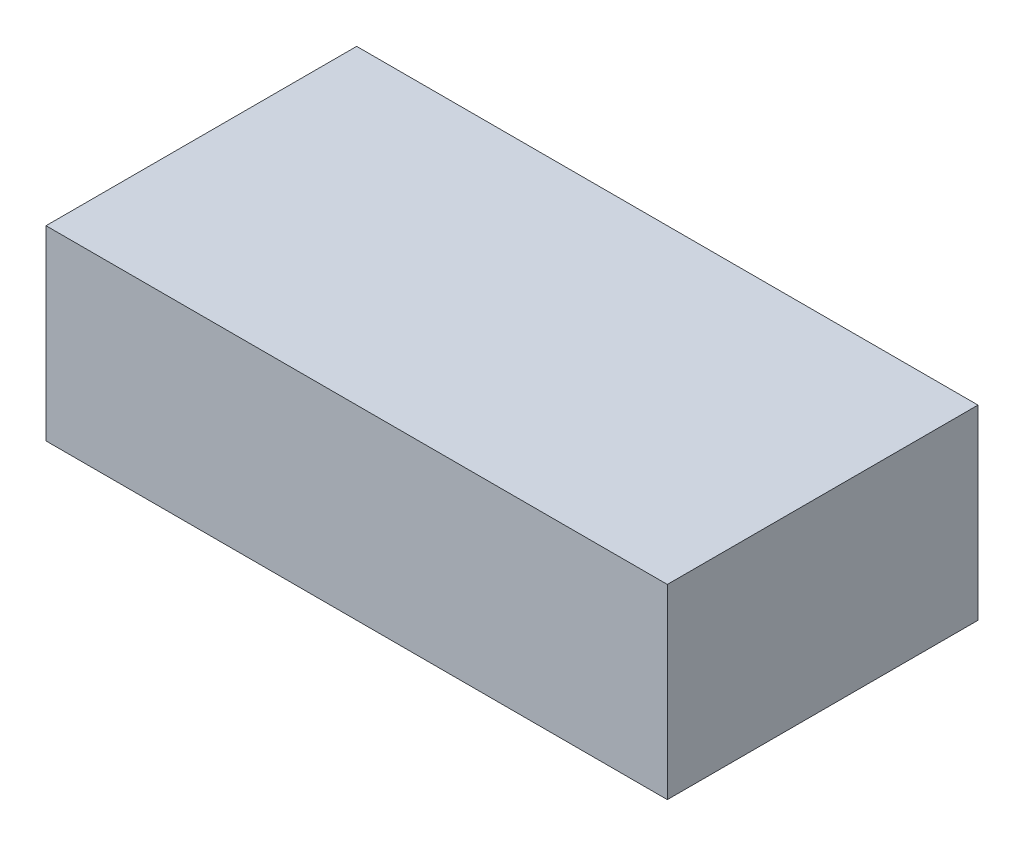
ISO-10303-21;
HEADER;
FILE_DESCRIPTION(('STEP AP214'),'2;1');
FILE_NAME('part.step','',(''),(''),'','','');
FILE_SCHEMA(('AUTOMOTIVE_DESIGN { 1 0 10303 214 1 1 1 1 }'));
ENDSEC;
DATA;
#1=APPLICATION_CONTEXT('core data for automotive mechanical design processes');
#2=APPLICATION_PROTOCOL_DEFINITION('international standard','automotive_design',2000,#1);
#3=PRODUCT_CONTEXT('',#1,'mechanical');
#4=PRODUCT('Part','Part','',(#3));
#5=PRODUCT_RELATED_PRODUCT_CATEGORY('part','',(#4));
#6=PRODUCT_DEFINITION_FORMATION('','',#4);
#7=PRODUCT_DEFINITION_CONTEXT('part definition',#1,'design');
#8=PRODUCT_DEFINITION('design','',#6,#7);
#9=PRODUCT_DEFINITION_SHAPE('','',#8);
#10=(LENGTH_UNIT() NAMED_UNIT(*) SI_UNIT(.MILLI.,.METRE.));
#11=(NAMED_UNIT(*) PLANE_ANGLE_UNIT() SI_UNIT($,.RADIAN.));
#12=(NAMED_UNIT(*) SI_UNIT($,.STERADIAN.) SOLID_ANGLE_UNIT());
#13=UNCERTAINTY_MEASURE_WITH_UNIT(LENGTH_MEASURE(1.E-05),#10,'distance_accuracy_value','');
#14=(GEOMETRIC_REPRESENTATION_CONTEXT(3) GLOBAL_UNCERTAINTY_ASSIGNED_CONTEXT((#13)) GLOBAL_UNIT_ASSIGNED_CONTEXT((#10,
#11,#12)) REPRESENTATION_CONTEXT('',''));
#15=CARTESIAN_POINT('',(0.,0.,0.));
#16=DIRECTION('',(0.,0.,1.));
#17=DIRECTION('',(1.,0.,0.));
#18=AXIS2_PLACEMENT_3D('',#15,#16,#17);
#19=CARTESIAN_POINT('',(-100.,60.,-50.));
#20=DIRECTION('',(1.,0.,0.));
#21=DIRECTION('',(0.,0.,-1.));
#22=AXIS2_PLACEMENT_3D('',#19,#20,#21);
#23=PLANE('',#22);
#24=DIRECTION('',(0.,0.,1.));
#25=VECTOR('',#24,1.);
#26=CARTESIAN_POINT('',(-100.,0.,-50.));
#27=LINE('',#26,#25);
#28=CARTESIAN_POINT('',(-100.,0.,-50.));
#29=VERTEX_POINT('',#28);
#30=CARTESIAN_POINT('',(-100.,0.,50.));
#31=VERTEX_POINT('',#30);
#32=EDGE_CURVE('E107',#29,#31,#27,.T.);
#33=ORIENTED_EDGE('',*,*,#32,.T.);
#34=DIRECTION('',(0.,-1.,0.));
#35=VECTOR('',#34,1.);
#36=CARTESIAN_POINT('',(-100.,60.,50.));
#37=LINE('',#36,#35);
#38=CARTESIAN_POINT('',(-100.,60.,50.));
#39=VERTEX_POINT('',#38);
#40=EDGE_CURVE('E11',#39,#31,#37,.T.);
#41=ORIENTED_EDGE('',*,*,#40,.F.);
#42=DIRECTION('',(0.,0.,1.));
#43=VECTOR('',#42,1.);
#44=CARTESIAN_POINT('',(-100.,60.,-50.));
#45=LINE('',#44,#43);
#46=CARTESIAN_POINT('',(-100.,60.,-50.));
#47=VERTEX_POINT('',#46);
#48=EDGE_CURVE('E89',#47,#39,#45,.T.);
#49=ORIENTED_EDGE('',*,*,#48,.F.);
#50=DIRECTION('',(0.,-1.,0.));
#51=VECTOR('',#50,1.);
#52=CARTESIAN_POINT('',(-100.,60.,-50.));
#53=LINE('',#52,#51);
#54=EDGE_CURVE('E56',#47,#29,#53,.T.);
#55=ORIENTED_EDGE('',*,*,#54,.T.);
#56=EDGE_LOOP('',(#33,#41,#49,#55));
#57=FACE_BOUND('',#56,.T.);
#58=ADVANCED_FACE('F39',(#57),#23,.F.);
#59=CARTESIAN_POINT('',(-100.,60.,50.));
#60=DIRECTION('',(0.,0.,-1.));
#61=DIRECTION('',(-1.,0.,0.));
#62=AXIS2_PLACEMENT_3D('',#59,#60,#61);
#63=PLANE('',#62);
#64=DIRECTION('',(1.,0.,0.));
#65=VECTOR('',#64,1.);
#66=CARTESIAN_POINT('',(-100.,0.,50.));
#67=LINE('',#66,#65);
#68=CARTESIAN_POINT('',(100.,0.,50.));
#69=VERTEX_POINT('',#68);
#70=EDGE_CURVE('E95',#31,#69,#67,.T.);
#71=ORIENTED_EDGE('',*,*,#70,.T.);
#72=DIRECTION('',(0.,-1.,0.));
#73=VECTOR('',#72,1.);
#74=CARTESIAN_POINT('',(100.,60.,50.));
#75=LINE('',#74,#73);
#76=CARTESIAN_POINT('',(100.,60.,50.));
#77=VERTEX_POINT('',#76);
#78=EDGE_CURVE('E48',#77,#69,#75,.T.);
#79=ORIENTED_EDGE('',*,*,#78,.F.);
#80=DIRECTION('',(1.,0.,0.));
#81=VECTOR('',#80,1.);
#82=CARTESIAN_POINT('',(-100.,60.,50.));
#83=LINE('',#82,#81);
#84=EDGE_CURVE('E81',#39,#77,#83,.T.);
#85=ORIENTED_EDGE('',*,*,#84,.F.);
#86=ORIENTED_EDGE('',*,*,#40,.T.);
#87=EDGE_LOOP('',(#71,#79,#85,#86));
#88=FACE_BOUND('',#87,.T.);
#89=ADVANCED_FACE('F94',(#88),#63,.F.);
#90=CARTESIAN_POINT('',(100.,60.,-50.));
#91=DIRECTION('',(1.,0.,0.));
#92=DIRECTION('',(0.,0.,-1.));
#93=AXIS2_PLACEMENT_3D('',#90,#91,#92);
#94=PLANE('',#93);
#95=DIRECTION('',(0.,0.,1.));
#96=VECTOR('',#95,1.);
#97=CARTESIAN_POINT('',(100.,0.,-50.));
#98=LINE('',#97,#96);
#99=CARTESIAN_POINT('',(100.,0.,-50.));
#100=VERTEX_POINT('',#99);
#101=EDGE_CURVE('E112',#100,#69,#98,.T.);
#102=ORIENTED_EDGE('',*,*,#101,.F.);
#103=DIRECTION('',(0.,-1.,0.));
#104=VECTOR('',#103,1.);
#105=CARTESIAN_POINT('',(100.,60.,-50.));
#106=LINE('',#105,#104);
#107=CARTESIAN_POINT('',(100.,60.,-50.));
#108=VERTEX_POINT('',#107);
#109=EDGE_CURVE('E70',#108,#100,#106,.T.);
#110=ORIENTED_EDGE('',*,*,#109,.F.);
#111=DIRECTION('',(0.,0.,1.));
#112=VECTOR('',#111,1.);
#113=CARTESIAN_POINT('',(100.,60.,-50.));
#114=LINE('',#113,#112);
#115=EDGE_CURVE('E88',#108,#77,#114,.T.);
#116=ORIENTED_EDGE('',*,*,#115,.T.);
#117=ORIENTED_EDGE('',*,*,#78,.T.);
#118=EDGE_LOOP('',(#102,#110,#116,#117));
#119=FACE_BOUND('',#118,.T.);
#120=ADVANCED_FACE('F99',(#119),#94,.T.);
#121=CARTESIAN_POINT('',(-100.,60.,-50.));
#122=DIRECTION('',(0.,0.,-1.));
#123=DIRECTION('',(-1.,0.,0.));
#124=AXIS2_PLACEMENT_3D('',#121,#122,#123);
#125=PLANE('',#124);
#126=DIRECTION('',(1.,0.,0.));
#127=VECTOR('',#126,1.);
#128=CARTESIAN_POINT('',(-100.,0.,-50.));
#129=LINE('',#128,#127);
#130=EDGE_CURVE('E115',#29,#100,#129,.T.);
#131=ORIENTED_EDGE('',*,*,#130,.F.);
#132=ORIENTED_EDGE('',*,*,#54,.F.);
#133=DIRECTION('',(1.,0.,0.));
#134=VECTOR('',#133,1.);
#135=CARTESIAN_POINT('',(-100.,60.,-50.));
#136=LINE('',#135,#134);
#137=EDGE_CURVE('E101',#47,#108,#136,.T.);
#138=ORIENTED_EDGE('',*,*,#137,.T.);
#139=ORIENTED_EDGE('',*,*,#109,.T.);
#140=EDGE_LOOP('',(#131,#132,#138,#139));
#141=FACE_BOUND('',#140,.T.);
#142=ADVANCED_FACE('F125',(#141),#125,.T.);
#143=CARTESIAN_POINT('',(0.,60.,0.));
#144=DIRECTION('',(0.,1.,0.));
#145=DIRECTION('',(0.,0.,1.));
#146=AXIS2_PLACEMENT_3D('',#143,#144,#145);
#147=PLANE('',#146);
#148=ORIENTED_EDGE('',*,*,#48,.T.);
#149=ORIENTED_EDGE('',*,*,#84,.T.);
#150=ORIENTED_EDGE('',*,*,#115,.F.);
#151=ORIENTED_EDGE('',*,*,#137,.F.);
#152=EDGE_LOOP('',(#148,#149,#150,#151));
#153=FACE_BOUND('',#152,.T.);
#154=ADVANCED_FACE('F85',(#153),#147,.T.);
#155=CARTESIAN_POINT('',(0.,0.,0.));
#156=DIRECTION('',(0.,1.,0.));
#157=DIRECTION('',(0.,0.,1.));
#158=AXIS2_PLACEMENT_3D('',#155,#156,#157);
#159=PLANE('',#158);
#160=ORIENTED_EDGE('',*,*,#32,.F.);
#161=ORIENTED_EDGE('',*,*,#130,.T.);
#162=ORIENTED_EDGE('',*,*,#101,.T.);
#163=ORIENTED_EDGE('',*,*,#70,.F.);
#164=EDGE_LOOP('',(#160,#161,#162,#163));
#165=FACE_BOUND('',#164,.T.);
#166=ADVANCED_FACE('F124',(#165),#159,.F.);
#167=CLOSED_SHELL('',(#58,#89,#120,#142,#154,#166));
#168=MANIFOLD_SOLID_BREP('B2',#167);
#169=ADVANCED_BREP_SHAPE_REPRESENTATION('',(#18,#168),#14);
#170=SHAPE_DEFINITION_REPRESENTATION(#9,#169);
ENDSEC;
END-ISO-10303-21;
